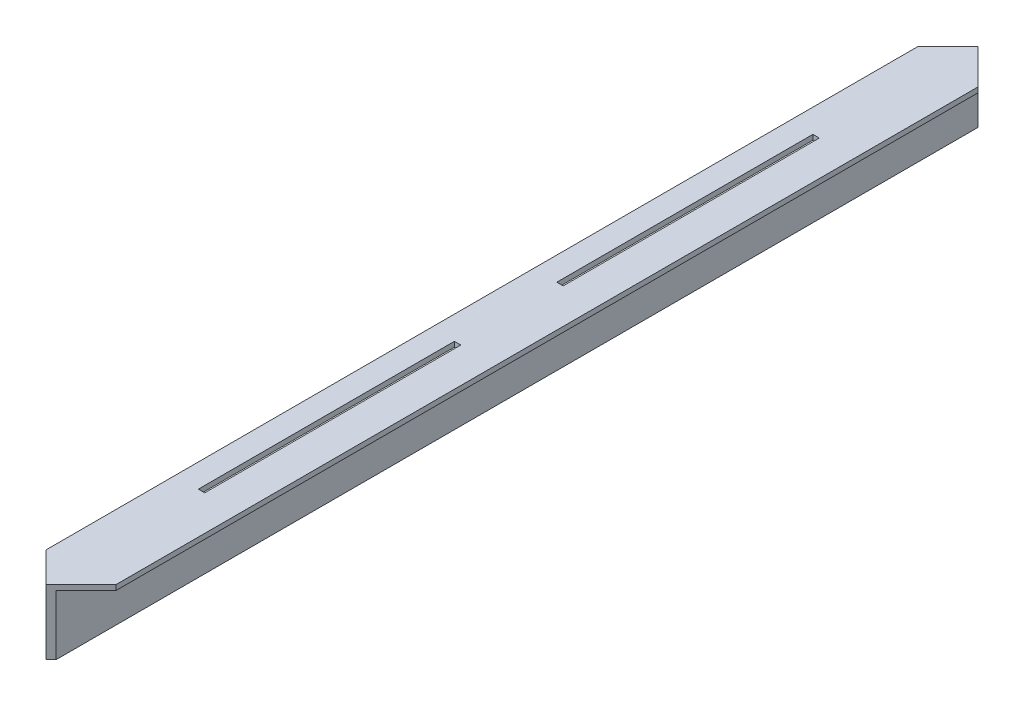
ISO-10303-21;
HEADER;
FILE_DESCRIPTION(('STEP AP214'),'2;1');
FILE_NAME('part.step','',(''),(''),'','','');
FILE_SCHEMA(('AUTOMOTIVE_DESIGN { 1 0 10303 214 1 1 1 1 }'));
ENDSEC;
DATA;
#1=APPLICATION_CONTEXT('core data for automotive mechanical design processes');
#2=APPLICATION_PROTOCOL_DEFINITION('international standard','automotive_design',2000,#1);
#3=PRODUCT_CONTEXT('',#1,'mechanical');
#4=PRODUCT('Part','Part','',(#3));
#5=PRODUCT_RELATED_PRODUCT_CATEGORY('part','',(#4));
#6=PRODUCT_DEFINITION_FORMATION('','',#4);
#7=PRODUCT_DEFINITION_CONTEXT('part definition',#1,'design');
#8=PRODUCT_DEFINITION('design','',#6,#7);
#9=PRODUCT_DEFINITION_SHAPE('','',#8);
#10=(LENGTH_UNIT() NAMED_UNIT(*) SI_UNIT(.MILLI.,.METRE.));
#11=(NAMED_UNIT(*) PLANE_ANGLE_UNIT() SI_UNIT($,.RADIAN.));
#12=(NAMED_UNIT(*) SI_UNIT($,.STERADIAN.) SOLID_ANGLE_UNIT());
#13=UNCERTAINTY_MEASURE_WITH_UNIT(LENGTH_MEASURE(1.E-05),#10,'distance_accuracy_value','');
#14=(GEOMETRIC_REPRESENTATION_CONTEXT(3) GLOBAL_UNCERTAINTY_ASSIGNED_CONTEXT((#13)) GLOBAL_UNIT_ASSIGNED_CONTEXT((#10,
#11,#12)) REPRESENTATION_CONTEXT('',''));
#15=CARTESIAN_POINT('',(0.,0.,0.));
#16=DIRECTION('',(0.,0.,1.));
#17=DIRECTION('',(1.,0.,0.));
#18=AXIS2_PLACEMENT_3D('',#15,#16,#17);
#19=CARTESIAN_POINT('',(-1.,-1.99999999999999,182.));
#20=DIRECTION('',(0.,1.,0.));
#21=DIRECTION('',(-1.,0.,0.));
#22=AXIS2_PLACEMENT_3D('',#19,#20,#21);
#23=PLANE('',#22);
#24=DIRECTION('',(0.,0.,-1.));
#25=VECTOR('',#24,1.);
#26=CARTESIAN_POINT('',(-12.7,-1.99999999999999,182.));
#27=LINE('',#26,#25);
#28=CARTESIAN_POINT('',(-12.7,-1.99999999999999,170.3));
#29=VERTEX_POINT('',#28);
#30=CARTESIAN_POINT('',(-12.7,-1.99999999999999,-170.3));
#31=VERTEX_POINT('',#30);
#32=EDGE_CURVE('E194',#29,#31,#27,.T.);
#33=ORIENTED_EDGE('',*,*,#32,.T.);
#34=DIRECTION('',(0.70710678118654,0.,-0.707106781186555));
#35=VECTOR('',#34,1.);
#36=CARTESIAN_POINT('',(-183.,-2.00000000000002,4.10782519111308E-12));
#37=LINE('',#36,#35);
#38=CARTESIAN_POINT('',(-1.,-1.99999999999999,-182.));
#39=VERTEX_POINT('',#38);
#40=EDGE_CURVE('E286',#31,#39,#37,.T.);
#41=ORIENTED_EDGE('',*,*,#40,.T.);
#42=DIRECTION('',(0.,0.,-1.));
#43=VECTOR('',#42,1.);
#44=CARTESIAN_POINT('',(-1.,-1.99999999999999,182.));
#45=LINE('',#44,#43);
#46=CARTESIAN_POINT('',(-1.,-1.99999999999999,-120.));
#47=VERTEX_POINT('',#46);
#48=EDGE_CURVE('E213',#47,#39,#45,.T.);
#49=ORIENTED_EDGE('',*,*,#48,.F.);
#50=DIRECTION('',(-1.,0.,0.));
#51=VECTOR('',#50,1.);
#52=CARTESIAN_POINT('',(-0.999999999998324,-1.99999999999999,-120.));
#53=LINE('',#52,#51);
#54=CARTESIAN_POINT('',(-3.5,-1.99999999999999,-120.));
#55=VERTEX_POINT('',#54);
#56=EDGE_CURVE('E252',#47,#55,#53,.T.);
#57=ORIENTED_EDGE('',*,*,#56,.T.);
#58=DIRECTION('',(0.,0.,1.));
#59=VECTOR('',#58,1.);
#60=CARTESIAN_POINT('',(-3.5,-1.99999999999999,182.));
#61=LINE('',#60,#59);
#62=CARTESIAN_POINT('',(-3.5,-1.99999999999999,-20.));
#63=VERTEX_POINT('',#62);
#64=EDGE_CURVE('E246',#55,#63,#61,.T.);
#65=ORIENTED_EDGE('',*,*,#64,.T.);
#66=DIRECTION('',(1.,0.,0.));
#67=VECTOR('',#66,1.);
#68=CARTESIAN_POINT('',(-1.00000000000084,-1.99999999999999,-20.));
#69=LINE('',#68,#67);
#70=CARTESIAN_POINT('',(-1.,-1.99999999999999,-20.));
#71=VERTEX_POINT('',#70);
#72=EDGE_CURVE('E244',#63,#71,#69,.T.);
#73=ORIENTED_EDGE('',*,*,#72,.T.);
#74=CARTESIAN_POINT('',(-1.,-1.99999999999999,20.));
#75=VERTEX_POINT('',#74);
#76=EDGE_CURVE('E216',#75,#71,#45,.T.);
#77=ORIENTED_EDGE('',*,*,#76,.F.);
#78=DIRECTION('',(-1.,0.,0.));
#79=VECTOR('',#78,1.);
#80=CARTESIAN_POINT('',(-0.999999999999326,-1.99999999999999,20.));
#81=LINE('',#80,#79);
#82=CARTESIAN_POINT('',(-3.5,-1.99999999999999,20.));
#83=VERTEX_POINT('',#82);
#84=EDGE_CURVE('E263',#75,#83,#81,.T.);
#85=ORIENTED_EDGE('',*,*,#84,.T.);
#86=DIRECTION('',(0.,0.,1.));
#87=VECTOR('',#86,1.);
#88=CARTESIAN_POINT('',(-3.5,-1.99999999999999,182.));
#89=LINE('',#88,#87);
#90=CARTESIAN_POINT('',(-3.5,-1.99999999999999,120.));
#91=VERTEX_POINT('',#90);
#92=EDGE_CURVE('E260',#83,#91,#89,.T.);
#93=ORIENTED_EDGE('',*,*,#92,.T.);
#94=DIRECTION('',(1.,0.,0.));
#95=VECTOR('',#94,1.);
#96=CARTESIAN_POINT('',(-1.00000000000034,-1.99999999999999,120.));
#97=LINE('',#96,#95);
#98=CARTESIAN_POINT('',(-1.,-1.99999999999999,120.));
#99=VERTEX_POINT('',#98);
#100=EDGE_CURVE('E257',#91,#99,#97,.T.);
#101=ORIENTED_EDGE('',*,*,#100,.T.);
#102=CARTESIAN_POINT('',(-1.,-1.99999999999999,182.));
#103=VERTEX_POINT('',#102);
#104=EDGE_CURVE('E214',#103,#99,#45,.T.);
#105=ORIENTED_EDGE('',*,*,#104,.F.);
#106=DIRECTION('',(-0.707106781186548,0.,-0.707106781186547));
#107=VECTOR('',#106,1.);
#108=CARTESIAN_POINT('',(-1.,-1.99999999999999,182.));
#109=LINE('',#108,#107);
#110=EDGE_CURVE('E155',#103,#29,#109,.T.);
#111=ORIENTED_EDGE('',*,*,#110,.T.);
#112=EDGE_LOOP('',(#33,#41,#49,#57,#65,#73,#77,#85,#93,#101,#105,#111));
#113=FACE_BOUND('',#112,.T.);
#114=ADVANCED_FACE('F33',(#113),#23,.F.);
#115=CARTESIAN_POINT('',(-1.,-1.99999999999999,182.));
#116=DIRECTION('',(1.,0.,0.));
#117=DIRECTION('',(0.,1.,0.));
#118=AXIS2_PLACEMENT_3D('',#115,#116,#117);
#119=PLANE('',#118);
#120=DIRECTION('',(0.,-1.,0.));
#121=VECTOR('',#120,1.);
#122=CARTESIAN_POINT('',(-1.,-1.99999999999999,-182.));
#123=LINE('',#122,#121);
#124=CARTESIAN_POINT('',(-1.,-25.4,-182.));
#125=VERTEX_POINT('',#124);
#126=EDGE_CURVE('E191',#39,#125,#123,.T.);
#127=ORIENTED_EDGE('',*,*,#126,.T.);
#128=DIRECTION('',(0.,0.,-1.));
#129=VECTOR('',#128,1.);
#130=CARTESIAN_POINT('',(-0.999999999999997,-25.4,182.));
#131=LINE('',#130,#129);
#132=CARTESIAN_POINT('',(-1.,-25.4,182.));
#133=VERTEX_POINT('',#132);
#134=EDGE_CURVE('E211',#133,#125,#131,.T.);
#135=ORIENTED_EDGE('',*,*,#134,.F.);
#136=DIRECTION('',(0.,-1.,0.));
#137=VECTOR('',#136,1.);
#138=CARTESIAN_POINT('',(-1.,-1.99999999999999,182.));
#139=LINE('',#138,#137);
#140=EDGE_CURVE('E192',#103,#133,#139,.T.);
#141=ORIENTED_EDGE('',*,*,#140,.F.);
#142=ORIENTED_EDGE('',*,*,#104,.T.);
#143=DIRECTION('',(0.,1.,0.));
#144=VECTOR('',#143,1.);
#145=CARTESIAN_POINT('',(-1.,-25.4,120.));
#146=LINE('',#145,#144);
#147=CARTESIAN_POINT('',(-1.,0.,120.));
#148=VERTEX_POINT('',#147);
#149=EDGE_CURVE('E274',#99,#148,#146,.T.);
#150=ORIENTED_EDGE('',*,*,#149,.T.);
#151=DIRECTION('',(0.,0.,-1.));
#152=VECTOR('',#151,1.);
#153=CARTESIAN_POINT('',(-1.,0.,120.));
#154=LINE('',#153,#152);
#155=CARTESIAN_POINT('',(-0.999999999999999,0.,20.));
#156=VERTEX_POINT('',#155);
#157=EDGE_CURVE('E284',#148,#156,#154,.T.);
#158=ORIENTED_EDGE('',*,*,#157,.T.);
#159=DIRECTION('',(0.,1.,0.));
#160=VECTOR('',#159,1.);
#161=CARTESIAN_POINT('',(-1.,-25.4,20.));
#162=LINE('',#161,#160);
#163=EDGE_CURVE('E267',#75,#156,#162,.T.);
#164=ORIENTED_EDGE('',*,*,#163,.F.);
#165=ORIENTED_EDGE('',*,*,#76,.T.);
#166=DIRECTION('',(0.,1.,0.));
#167=VECTOR('',#166,1.);
#168=CARTESIAN_POINT('',(-1.,-25.4,-20.));
#169=LINE('',#168,#167);
#170=CARTESIAN_POINT('',(-1.,0.,-20.));
#171=VERTEX_POINT('',#170);
#172=EDGE_CURVE('E287',#71,#171,#169,.T.);
#173=ORIENTED_EDGE('',*,*,#172,.T.);
#174=DIRECTION('',(0.,0.,-1.));
#175=VECTOR('',#174,1.);
#176=CARTESIAN_POINT('',(-1.,0.,-120.));
#177=LINE('',#176,#175);
#178=CARTESIAN_POINT('',(-1.,0.,-120.));
#179=VERTEX_POINT('',#178);
#180=EDGE_CURVE('E300',#171,#179,#177,.T.);
#181=ORIENTED_EDGE('',*,*,#180,.T.);
#182=DIRECTION('',(0.,1.,0.));
#183=VECTOR('',#182,1.);
#184=CARTESIAN_POINT('',(-1.,-25.4,-120.));
#185=LINE('',#184,#183);
#186=EDGE_CURVE('E55',#47,#179,#185,.T.);
#187=ORIENTED_EDGE('',*,*,#186,.F.);
#188=ORIENTED_EDGE('',*,*,#48,.T.);
#189=EDGE_LOOP('',(#127,#135,#141,#142,#150,#158,#164,#165,#173,#181,#187,#188));
#190=FACE_BOUND('',#189,.T.);
#191=ADVANCED_FACE('F315',(#190),#119,.F.);
#192=CARTESIAN_POINT('',(-0.999999999999997,-25.4,182.));
#193=DIRECTION('',(0.,1.,0.));
#194=DIRECTION('',(0.,0.,1.));
#195=AXIS2_PLACEMENT_3D('',#192,#193,#194);
#196=PLANE('',#195);
#197=ORIENTED_EDGE('',*,*,#134,.T.);
#198=DIRECTION('',(0.707106781186548,0.,0.707106781186547));
#199=VECTOR('',#198,1.);
#200=CARTESIAN_POINT('',(181.,-25.4,-1.38777878078145E-13));
#201=LINE('',#200,#199);
#202=CARTESIAN_POINT('',(0.999999999999997,-25.4,-180.));
#203=VERTEX_POINT('',#202);
#204=EDGE_CURVE('E176',#125,#203,#201,.T.);
#205=ORIENTED_EDGE('',*,*,#204,.T.);
#206=DIRECTION('',(0.,0.,-1.));
#207=VECTOR('',#206,1.);
#208=CARTESIAN_POINT('',(0.999999999999997,-25.4,182.));
#209=LINE('',#208,#207);
#210=CARTESIAN_POINT('',(0.999999999999997,-25.4,180.));
#211=VERTEX_POINT('',#210);
#212=EDGE_CURVE('E208',#211,#203,#209,.T.);
#213=ORIENTED_EDGE('',*,*,#212,.F.);
#214=DIRECTION('',(-0.707106781186548,0.,0.707106781186547));
#215=VECTOR('',#214,1.);
#216=CARTESIAN_POINT('',(-0.999999999999999,-25.4,182.));
#217=LINE('',#216,#215);
#218=EDGE_CURVE('E188',#211,#133,#217,.T.);
#219=ORIENTED_EDGE('',*,*,#218,.T.);
#220=EDGE_LOOP('',(#197,#205,#213,#219));
#221=FACE_BOUND('',#220,.T.);
#222=ADVANCED_FACE('F318',(#221),#196,.F.);
#223=CARTESIAN_POINT('',(1.,-1.99999999999999,182.));
#224=DIRECTION('',(-1.,0.,0.));
#225=DIRECTION('',(0.,-1.,0.));
#226=AXIS2_PLACEMENT_3D('',#223,#224,#225);
#227=PLANE('',#226);
#228=ORIENTED_EDGE('',*,*,#212,.T.);
#229=DIRECTION('',(0.,1.,0.));
#230=VECTOR('',#229,1.);
#231=CARTESIAN_POINT('',(1.,-1.99999999999995,-180.));
#232=LINE('',#231,#230);
#233=CARTESIAN_POINT('',(1.00000000000003,-1.99999999999999,-180.));
#234=VERTEX_POINT('',#233);
#235=EDGE_CURVE('E182',#203,#234,#232,.T.);
#236=ORIENTED_EDGE('',*,*,#235,.T.);
#237=DIRECTION('',(0.,0.,-1.));
#238=VECTOR('',#237,1.);
#239=CARTESIAN_POINT('',(1.,-1.99999999999999,182.));
#240=LINE('',#239,#238);
#241=CARTESIAN_POINT('',(1.,-1.99999999999999,180.));
#242=VERTEX_POINT('',#241);
#243=EDGE_CURVE('E205',#242,#234,#240,.T.);
#244=ORIENTED_EDGE('',*,*,#243,.F.);
#245=DIRECTION('',(0.,-1.,0.));
#246=VECTOR('',#245,1.);
#247=CARTESIAN_POINT('',(1.,-1.99999999999999,180.));
#248=LINE('',#247,#246);
#249=EDGE_CURVE('E179',#242,#211,#248,.T.);
#250=ORIENTED_EDGE('',*,*,#249,.T.);
#251=EDGE_LOOP('',(#228,#236,#244,#250));
#252=FACE_BOUND('',#251,.T.);
#253=ADVANCED_FACE('F237',(#252),#227,.F.);
#254=CARTESIAN_POINT('',(1.,-1.99999999999999,182.));
#255=DIRECTION('',(0.,1.,0.));
#256=DIRECTION('',(-1.,0.,0.));
#257=AXIS2_PLACEMENT_3D('',#254,#255,#256);
#258=PLANE('',#257);
#259=ORIENTED_EDGE('',*,*,#243,.T.);
#260=DIRECTION('',(0.707106781186548,0.,0.707106781186547));
#261=VECTOR('',#260,1.);
#262=CARTESIAN_POINT('',(182.,-2.00000000000002,0.999999999999862));
#263=LINE('',#262,#261);
#264=CARTESIAN_POINT('',(12.7,-1.99999999999999,-168.3));
#265=VERTEX_POINT('',#264);
#266=EDGE_CURVE('E227',#234,#265,#263,.T.);
#267=ORIENTED_EDGE('',*,*,#266,.T.);
#268=DIRECTION('',(0.,0.,-1.));
#269=VECTOR('',#268,1.);
#270=CARTESIAN_POINT('',(12.7,-1.99999999999999,182.));
#271=LINE('',#270,#269);
#272=CARTESIAN_POINT('',(12.7,-1.99999999999999,168.3));
#273=VERTEX_POINT('',#272);
#274=EDGE_CURVE('E202',#273,#265,#271,.T.);
#275=ORIENTED_EDGE('',*,*,#274,.F.);
#276=DIRECTION('',(-0.707106781186548,0.,0.707106781186547));
#277=VECTOR('',#276,1.);
#278=CARTESIAN_POINT('',(0.,-1.99999999999999,181.));
#279=LINE('',#278,#277);
#280=EDGE_CURVE('E175',#273,#242,#279,.T.);
#281=ORIENTED_EDGE('',*,*,#280,.T.);
#282=EDGE_LOOP('',(#259,#267,#275,#281));
#283=FACE_BOUND('',#282,.T.);
#284=ADVANCED_FACE('F240',(#283),#258,.F.);
#285=CARTESIAN_POINT('',(12.7,-1.99999999999999,182.));
#286=DIRECTION('',(-1.,0.,0.));
#287=DIRECTION('',(0.,0.,1.));
#288=AXIS2_PLACEMENT_3D('',#285,#286,#287);
#289=PLANE('',#288);
#290=ORIENTED_EDGE('',*,*,#274,.T.);
#291=DIRECTION('',(0.,1.,0.));
#292=VECTOR('',#291,1.);
#293=CARTESIAN_POINT('',(12.7,-50.,-168.3));
#294=LINE('',#293,#292);
#295=CARTESIAN_POINT('',(12.7,0.,-168.3));
#296=VERTEX_POINT('',#295);
#297=EDGE_CURVE('E228',#265,#296,#294,.T.);
#298=ORIENTED_EDGE('',*,*,#297,.T.);
#299=DIRECTION('',(0.,0.,-1.));
#300=VECTOR('',#299,1.);
#301=CARTESIAN_POINT('',(12.7,0.,182.));
#302=LINE('',#301,#300);
#303=CARTESIAN_POINT('',(12.7,0.,168.3));
#304=VERTEX_POINT('',#303);
#305=EDGE_CURVE('E200',#304,#296,#302,.T.);
#306=ORIENTED_EDGE('',*,*,#305,.F.);
#307=DIRECTION('',(0.,1.,0.));
#308=VECTOR('',#307,1.);
#309=CARTESIAN_POINT('',(12.7,-50.,168.3));
#310=LINE('',#309,#308);
#311=EDGE_CURVE('E174',#273,#304,#310,.T.);
#312=ORIENTED_EDGE('',*,*,#311,.F.);
#313=EDGE_LOOP('',(#290,#298,#306,#312));
#314=FACE_BOUND('',#313,.T.);
#315=ADVANCED_FACE('F243',(#314),#289,.F.);
#316=CARTESIAN_POINT('',(-12.7,0.,182.));
#317=DIRECTION('',(0.,-1.,0.));
#318=DIRECTION('',(0.,0.,-1.));
#319=AXIS2_PLACEMENT_3D('',#316,#317,#318);
#320=PLANE('',#319);
#321=ORIENTED_EDGE('',*,*,#180,.F.);
#322=DIRECTION('',(1.,0.,0.));
#323=VECTOR('',#322,1.);
#324=CARTESIAN_POINT('',(-1.,0.,-20.));
#325=LINE('',#324,#323);
#326=CARTESIAN_POINT('',(-3.5,0.,-20.));
#327=VERTEX_POINT('',#326);
#328=EDGE_CURVE('E276',#327,#171,#325,.T.);
#329=ORIENTED_EDGE('',*,*,#328,.F.);
#330=DIRECTION('',(0.,0.,1.));
#331=VECTOR('',#330,1.);
#332=CARTESIAN_POINT('',(-3.5,0.,-20.));
#333=LINE('',#332,#331);
#334=CARTESIAN_POINT('',(-3.5,0.,-120.));
#335=VERTEX_POINT('',#334);
#336=EDGE_CURVE('E290',#335,#327,#333,.T.);
#337=ORIENTED_EDGE('',*,*,#336,.F.);
#338=DIRECTION('',(-1.,0.,0.));
#339=VECTOR('',#338,1.);
#340=CARTESIAN_POINT('',(-1.,0.,-120.));
#341=LINE('',#340,#339);
#342=EDGE_CURVE('E297',#179,#335,#341,.T.);
#343=ORIENTED_EDGE('',*,*,#342,.F.);
#344=EDGE_LOOP('',(#321,#329,#337,#343));
#345=FACE_BOUND('',#344,.T.);
#346=DIRECTION('',(-1.,0.,0.));
#347=VECTOR('',#346,1.);
#348=CARTESIAN_POINT('',(-1.,0.,20.));
#349=LINE('',#348,#347);
#350=CARTESIAN_POINT('',(-3.5,0.,20.));
#351=VERTEX_POINT('',#350);
#352=EDGE_CURVE('E282',#156,#351,#349,.T.);
#353=ORIENTED_EDGE('',*,*,#352,.F.);
#354=ORIENTED_EDGE('',*,*,#157,.F.);
#355=DIRECTION('',(1.,0.,0.));
#356=VECTOR('',#355,1.);
#357=CARTESIAN_POINT('',(-1.,0.,120.));
#358=LINE('',#357,#356);
#359=CARTESIAN_POINT('',(-3.5,0.,120.));
#360=VERTEX_POINT('',#359);
#361=EDGE_CURVE('E270',#360,#148,#358,.T.);
#362=ORIENTED_EDGE('',*,*,#361,.F.);
#363=DIRECTION('',(0.,0.,1.));
#364=VECTOR('',#363,1.);
#365=CARTESIAN_POINT('',(-3.5,0.,20.));
#366=LINE('',#365,#364);
#367=EDGE_CURVE('E279',#351,#360,#366,.T.);
#368=ORIENTED_EDGE('',*,*,#367,.F.);
#369=EDGE_LOOP('',(#353,#354,#362,#368));
#370=FACE_BOUND('',#369,.T.);
#371=DIRECTION('',(-0.707106781186548,0.,-0.707106781186547));
#372=VECTOR('',#371,1.);
#373=CARTESIAN_POINT('',(175.15,0.,-5.85000000000013));
#374=LINE('',#373,#372);
#375=CARTESIAN_POINT('',(-1.,0.,-182.));
#376=VERTEX_POINT('',#375);
#377=EDGE_CURVE('E221',#296,#376,#374,.T.);
#378=ORIENTED_EDGE('',*,*,#377,.T.);
#379=DIRECTION('',(-0.70710678118654,0.,0.707106781186555));
#380=VECTOR('',#379,1.);
#381=CARTESIAN_POINT('',(-188.85,0.,5.8500000000041));
#382=LINE('',#381,#380);
#383=CARTESIAN_POINT('',(-12.7,0.,-170.3));
#384=VERTEX_POINT('',#383);
#385=EDGE_CURVE('E226',#376,#384,#382,.T.);
#386=ORIENTED_EDGE('',*,*,#385,.T.);
#387=DIRECTION('',(0.,0.,-1.));
#388=VECTOR('',#387,1.);
#389=CARTESIAN_POINT('',(-12.7,0.,182.));
#390=LINE('',#389,#388);
#391=CARTESIAN_POINT('',(-12.7,0.,170.3));
#392=VERTEX_POINT('',#391);
#393=EDGE_CURVE('E169',#392,#384,#390,.T.);
#394=ORIENTED_EDGE('',*,*,#393,.F.);
#395=DIRECTION('',(0.707106781186548,0.,0.707106781186547));
#396=VECTOR('',#395,1.);
#397=CARTESIAN_POINT('',(-6.85,0.,176.15));
#398=LINE('',#397,#396);
#399=CARTESIAN_POINT('',(-1.,0.,182.));
#400=VERTEX_POINT('',#399);
#401=EDGE_CURVE('E152',#392,#400,#398,.T.);
#402=ORIENTED_EDGE('',*,*,#401,.T.);
#403=DIRECTION('',(0.707106781186548,0.,-0.707106781186547));
#404=VECTOR('',#403,1.);
#405=CARTESIAN_POINT('',(-6.85,0.,187.85));
#406=LINE('',#405,#404);
#407=EDGE_CURVE('E165',#400,#304,#406,.T.);
#408=ORIENTED_EDGE('',*,*,#407,.T.);
#409=ORIENTED_EDGE('',*,*,#305,.T.);
#410=EDGE_LOOP('',(#378,#386,#394,#402,#408,#409));
#411=FACE_BOUND('',#410,.T.);
#412=ADVANCED_FACE('F163',(#345,#370,#411),#320,.F.);
#413=CARTESIAN_POINT('',(-12.7,-1.99999999999999,182.));
#414=DIRECTION('',(1.,0.,0.));
#415=DIRECTION('',(0.,0.,-1.));
#416=AXIS2_PLACEMENT_3D('',#413,#414,#415);
#417=PLANE('',#416);
#418=ORIENTED_EDGE('',*,*,#393,.T.);
#419=DIRECTION('',(0.,1.,0.));
#420=VECTOR('',#419,1.);
#421=CARTESIAN_POINT('',(-12.7,-50.,-170.3));
#422=LINE('',#421,#420);
#423=EDGE_CURVE('E170',#31,#384,#422,.T.);
#424=ORIENTED_EDGE('',*,*,#423,.F.);
#425=ORIENTED_EDGE('',*,*,#32,.F.);
#426=DIRECTION('',(0.,1.,0.));
#427=VECTOR('',#426,1.);
#428=CARTESIAN_POINT('',(-12.7,-50.,170.3));
#429=LINE('',#428,#427);
#430=EDGE_CURVE('E306',#29,#392,#429,.T.);
#431=ORIENTED_EDGE('',*,*,#430,.T.);
#432=EDGE_LOOP('',(#418,#424,#425,#431));
#433=FACE_BOUND('',#432,.T.);
#434=ADVANCED_FACE('F312',(#433),#417,.F.);
#435=CARTESIAN_POINT('',(-1.,-50.,-182.));
#436=DIRECTION('',(-0.707106781186547,0.,0.707106781186548));
#437=DIRECTION('',(0.707106781186548,0.,0.707106781186547));
#438=AXIS2_PLACEMENT_3D('',#435,#436,#437);
#439=PLANE('',#438);
#440=ORIENTED_EDGE('',*,*,#126,.F.);
#441=DIRECTION('',(0.,1.,0.));
#442=VECTOR('',#441,1.);
#443=CARTESIAN_POINT('',(-1.,0.,-182.));
#444=LINE('',#443,#442);
#445=EDGE_CURVE('E40',#39,#376,#444,.T.);
#446=ORIENTED_EDGE('',*,*,#445,.T.);
#447=ORIENTED_EDGE('',*,*,#377,.F.);
#448=ORIENTED_EDGE('',*,*,#297,.F.);
#449=ORIENTED_EDGE('',*,*,#266,.F.);
#450=ORIENTED_EDGE('',*,*,#235,.F.);
#451=ORIENTED_EDGE('',*,*,#204,.F.);
#452=EDGE_LOOP('',(#440,#446,#447,#448,#449,#450,#451));
#453=FACE_BOUND('',#452,.T.);
#454=ADVANCED_FACE('F220',(#453),#439,.F.);
#455=CARTESIAN_POINT('',(-1.,-50.,182.));
#456=DIRECTION('',(-0.707106781186547,0.,-0.707106781186548));
#457=DIRECTION('',(-0.707106781186548,0.,0.707106781186547));
#458=AXIS2_PLACEMENT_3D('',#455,#456,#457);
#459=PLANE('',#458);
#460=ORIENTED_EDGE('',*,*,#249,.F.);
#461=ORIENTED_EDGE('',*,*,#280,.F.);
#462=ORIENTED_EDGE('',*,*,#311,.T.);
#463=ORIENTED_EDGE('',*,*,#407,.F.);
#464=DIRECTION('',(0.,1.,0.));
#465=VECTOR('',#464,1.);
#466=CARTESIAN_POINT('',(-1.,0.,182.));
#467=LINE('',#466,#465);
#468=EDGE_CURVE('E11',#103,#400,#467,.T.);
#469=ORIENTED_EDGE('',*,*,#468,.F.);
#470=ORIENTED_EDGE('',*,*,#140,.T.);
#471=ORIENTED_EDGE('',*,*,#218,.F.);
#472=EDGE_LOOP('',(#460,#461,#462,#463,#469,#470,#471));
#473=FACE_BOUND('',#472,.T.);
#474=ADVANCED_FACE('F172',(#473),#459,.F.);
#475=CARTESIAN_POINT('',(-1.,-25.4,120.));
#476=DIRECTION('',(0.,0.,1.));
#477=DIRECTION('',(1.,0.,0.));
#478=AXIS2_PLACEMENT_3D('',#475,#476,#477);
#479=PLANE('',#478);
#480=DIRECTION('',(0.,1.,0.));
#481=VECTOR('',#480,1.);
#482=CARTESIAN_POINT('',(-3.5,-25.4,120.));
#483=LINE('',#482,#481);
#484=EDGE_CURVE('E272',#91,#360,#483,.T.);
#485=ORIENTED_EDGE('',*,*,#484,.T.);
#486=ORIENTED_EDGE('',*,*,#361,.T.);
#487=ORIENTED_EDGE('',*,*,#149,.F.);
#488=ORIENTED_EDGE('',*,*,#100,.F.);
#489=EDGE_LOOP('',(#485,#486,#487,#488));
#490=FACE_BOUND('',#489,.T.);
#491=ADVANCED_FACE('F331',(#490),#479,.F.);
#492=CARTESIAN_POINT('',(-3.5,-25.4,20.));
#493=DIRECTION('',(-1.,0.,0.));
#494=DIRECTION('',(0.,0.,1.));
#495=AXIS2_PLACEMENT_3D('',#492,#493,#494);
#496=PLANE('',#495);
#497=DIRECTION('',(0.,1.,0.));
#498=VECTOR('',#497,1.);
#499=CARTESIAN_POINT('',(-3.5,-25.4,20.));
#500=LINE('',#499,#498);
#501=EDGE_CURVE('E47',#83,#351,#500,.T.);
#502=ORIENTED_EDGE('',*,*,#501,.T.);
#503=ORIENTED_EDGE('',*,*,#367,.T.);
#504=ORIENTED_EDGE('',*,*,#484,.F.);
#505=ORIENTED_EDGE('',*,*,#92,.F.);
#506=EDGE_LOOP('',(#502,#503,#504,#505));
#507=FACE_BOUND('',#506,.T.);
#508=ADVANCED_FACE('F329',(#507),#496,.F.);
#509=CARTESIAN_POINT('',(-1.,-25.4,20.));
#510=DIRECTION('',(0.,0.,-1.));
#511=DIRECTION('',(-1.,0.,0.));
#512=AXIS2_PLACEMENT_3D('',#509,#510,#511);
#513=PLANE('',#512);
#514=ORIENTED_EDGE('',*,*,#163,.T.);
#515=ORIENTED_EDGE('',*,*,#352,.T.);
#516=ORIENTED_EDGE('',*,*,#501,.F.);
#517=ORIENTED_EDGE('',*,*,#84,.F.);
#518=EDGE_LOOP('',(#514,#515,#516,#517));
#519=FACE_BOUND('',#518,.T.);
#520=ADVANCED_FACE('F321',(#519),#513,.F.);
#521=CARTESIAN_POINT('',(-1.,-25.4,-20.));
#522=DIRECTION('',(0.,0.,1.));
#523=DIRECTION('',(1.,0.,0.));
#524=AXIS2_PLACEMENT_3D('',#521,#522,#523);
#525=PLANE('',#524);
#526=DIRECTION('',(0.,1.,0.));
#527=VECTOR('',#526,1.);
#528=CARTESIAN_POINT('',(-3.5,-25.4,-20.));
#529=LINE('',#528,#527);
#530=EDGE_CURVE('E266',#63,#327,#529,.T.);
#531=ORIENTED_EDGE('',*,*,#530,.T.);
#532=ORIENTED_EDGE('',*,*,#328,.T.);
#533=ORIENTED_EDGE('',*,*,#172,.F.);
#534=ORIENTED_EDGE('',*,*,#72,.F.);
#535=EDGE_LOOP('',(#531,#532,#533,#534));
#536=FACE_BOUND('',#535,.T.);
#537=ADVANCED_FACE('F366',(#536),#525,.F.);
#538=CARTESIAN_POINT('',(-3.5,-25.4,-20.));
#539=DIRECTION('',(-1.,0.,0.));
#540=DIRECTION('',(0.,0.,1.));
#541=AXIS2_PLACEMENT_3D('',#538,#539,#540);
#542=PLANE('',#541);
#543=DIRECTION('',(0.,1.,0.));
#544=VECTOR('',#543,1.);
#545=CARTESIAN_POINT('',(-3.5,-25.4,-120.));
#546=LINE('',#545,#544);
#547=EDGE_CURVE('E292',#55,#335,#546,.T.);
#548=ORIENTED_EDGE('',*,*,#547,.T.);
#549=ORIENTED_EDGE('',*,*,#336,.T.);
#550=ORIENTED_EDGE('',*,*,#530,.F.);
#551=ORIENTED_EDGE('',*,*,#64,.F.);
#552=EDGE_LOOP('',(#548,#549,#550,#551));
#553=FACE_BOUND('',#552,.T.);
#554=ADVANCED_FACE('F370',(#553),#542,.F.);
#555=CARTESIAN_POINT('',(-1.,-25.4,-120.));
#556=DIRECTION('',(0.,0.,-1.));
#557=DIRECTION('',(-1.,0.,0.));
#558=AXIS2_PLACEMENT_3D('',#555,#556,#557);
#559=PLANE('',#558);
#560=ORIENTED_EDGE('',*,*,#186,.T.);
#561=ORIENTED_EDGE('',*,*,#342,.T.);
#562=ORIENTED_EDGE('',*,*,#547,.F.);
#563=ORIENTED_EDGE('',*,*,#56,.F.);
#564=EDGE_LOOP('',(#560,#561,#562,#563));
#565=FACE_BOUND('',#564,.T.);
#566=ADVANCED_FACE('F375',(#565),#559,.F.);
#567=CARTESIAN_POINT('',(-1.,-50.,182.));
#568=DIRECTION('',(0.707106781186547,0.,-0.707106781186548));
#569=DIRECTION('',(-0.707106781186548,0.,-0.707106781186547));
#570=AXIS2_PLACEMENT_3D('',#567,#568,#569);
#571=PLANE('',#570);
#572=ORIENTED_EDGE('',*,*,#468,.T.);
#573=ORIENTED_EDGE('',*,*,#401,.F.);
#574=ORIENTED_EDGE('',*,*,#430,.F.);
#575=ORIENTED_EDGE('',*,*,#110,.F.);
#576=EDGE_LOOP('',(#572,#573,#574,#575));
#577=FACE_BOUND('',#576,.T.);
#578=ADVANCED_FACE('F151',(#577),#571,.F.);
#579=CARTESIAN_POINT('',(-1.,-50.,-182.));
#580=DIRECTION('',(0.707106781186555,0.,0.70710678118654));
#581=DIRECTION('',(0.70710678118654,0.,-0.707106781186555));
#582=AXIS2_PLACEMENT_3D('',#579,#580,#581);
#583=PLANE('',#582);
#584=ORIENTED_EDGE('',*,*,#423,.T.);
#585=ORIENTED_EDGE('',*,*,#385,.F.);
#586=ORIENTED_EDGE('',*,*,#445,.F.);
#587=ORIENTED_EDGE('',*,*,#40,.F.);
#588=EDGE_LOOP('',(#584,#585,#586,#587));
#589=FACE_BOUND('',#588,.T.);
#590=ADVANCED_FACE('F309',(#589),#583,.F.);
#591=CLOSED_SHELL('',(#114,#191,#222,#253,#284,#315,#412,#434,#454,#474,#491,#508,#520,#537,
#554,#566,#578,#590));
#592=MANIFOLD_SOLID_BREP('B2',#591);
#593=ADVANCED_BREP_SHAPE_REPRESENTATION('',(#18,#592),#14);
#594=SHAPE_DEFINITION_REPRESENTATION(#9,#593);
ENDSEC;
END-ISO-10303-21;
